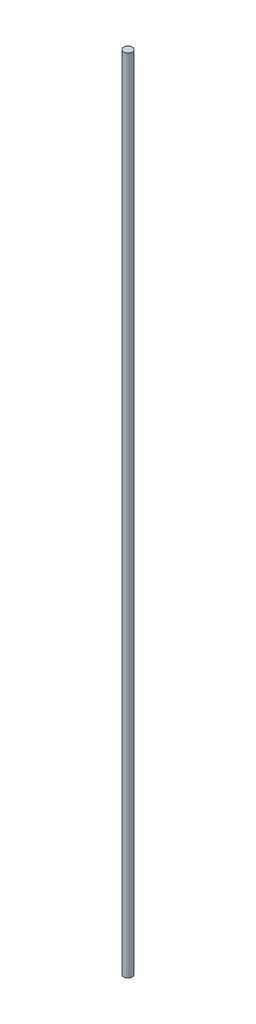
ISO-10303-21;
HEADER;
FILE_DESCRIPTION(('STEP AP214'),'2;1');
FILE_NAME('part.step','',(''),(''),'','','');
FILE_SCHEMA(('AUTOMOTIVE_DESIGN { 1 0 10303 214 1 1 1 1 }'));
ENDSEC;
DATA;
#1=APPLICATION_CONTEXT('core data for automotive mechanical design processes');
#2=APPLICATION_PROTOCOL_DEFINITION('international standard','automotive_design',2000,#1);
#3=PRODUCT_CONTEXT('',#1,'mechanical');
#4=PRODUCT('Part','Part','',(#3));
#5=PRODUCT_RELATED_PRODUCT_CATEGORY('part','',(#4));
#6=PRODUCT_DEFINITION_FORMATION('','',#4);
#7=PRODUCT_DEFINITION_CONTEXT('part definition',#1,'design');
#8=PRODUCT_DEFINITION('design','',#6,#7);
#9=PRODUCT_DEFINITION_SHAPE('','',#8);
#10=(LENGTH_UNIT() NAMED_UNIT(*) SI_UNIT(.MILLI.,.METRE.));
#11=(NAMED_UNIT(*) PLANE_ANGLE_UNIT() SI_UNIT($,.RADIAN.));
#12=(NAMED_UNIT(*) SI_UNIT($,.STERADIAN.) SOLID_ANGLE_UNIT());
#13=UNCERTAINTY_MEASURE_WITH_UNIT(LENGTH_MEASURE(1.E-05),#10,'distance_accuracy_value','');
#14=(GEOMETRIC_REPRESENTATION_CONTEXT(3) GLOBAL_UNCERTAINTY_ASSIGNED_CONTEXT((#13)) GLOBAL_UNIT_ASSIGNED_CONTEXT((#10,
#11,#12)) REPRESENTATION_CONTEXT('',''));
#15=CARTESIAN_POINT('',(0.,0.,0.));
#16=DIRECTION('',(0.,0.,1.));
#17=DIRECTION('',(1.,0.,0.));
#18=AXIS2_PLACEMENT_3D('',#15,#16,#17);
#19=CARTESIAN_POINT('',(0.,147.,0.));
#20=DIRECTION('',(0.,-1.,0.));
#21=DIRECTION('',(0.,0.,-1.));
#22=AXIS2_PLACEMENT_3D('',#19,#20,#21);
#23=PLANE('',#22);
#24=CARTESIAN_POINT('',(0.,147.,0.));
#25=DIRECTION('',(0.,-1.,0.));
#26=DIRECTION('',(1.,0.,0.));
#27=AXIS2_PLACEMENT_3D('',#24,#25,#26);
#28=CIRCLE('',#27,0.8);
#29=CARTESIAN_POINT('',(0.8,147.,0.));
#30=VERTEX_POINT('',#29);
#31=EDGE_CURVE('E11',#30,#30,#28,.T.);
#32=ORIENTED_EDGE('',*,*,#31,.F.);
#33=EDGE_LOOP('',(#32));
#34=FACE_BOUND('',#33,.T.);
#35=ADVANCED_FACE('F17',(#34),#23,.F.);
#36=CARTESIAN_POINT('',(0.,154.35,0.));
#37=DIRECTION('',(0.,-1.,0.));
#38=DIRECTION('',(-1.,0.,0.));
#39=AXIS2_PLACEMENT_3D('',#36,#37,#38);
#40=CYLINDRICAL_SURFACE('',#39,0.8);
#41=CARTESIAN_POINT('',(0.,0.,0.));
#42=DIRECTION('',(0.,1.,0.));
#43=DIRECTION('',(1.,0.,0.));
#44=AXIS2_PLACEMENT_3D('',#41,#42,#43);
#45=CIRCLE('',#44,0.8);
#46=CARTESIAN_POINT('',(0.8,0.,0.));
#47=VERTEX_POINT('',#46);
#48=EDGE_CURVE('E41',#47,#47,#45,.T.);
#49=ORIENTED_EDGE('',*,*,#48,.T.);
#50=DIRECTION('',(0.,1.,0.));
#51=VECTOR('',#50,1.);
#52=CARTESIAN_POINT('',(0.8,154.35,0.));
#53=LINE('',#52,#51);
#54=EDGE_CURVE('E26',#47,#30,#53,.T.);
#55=ORIENTED_EDGE('',*,*,#54,.T.);
#56=ORIENTED_EDGE('',*,*,#31,.T.);
#57=ORIENTED_EDGE('',*,*,#54,.F.);
#58=EDGE_LOOP('',(#49,#55,#56,#57));
#59=FACE_BOUND('',#58,.T.);
#60=ADVANCED_FACE('F19',(#59),#40,.T.);
#61=CARTESIAN_POINT('',(0.,0.,0.));
#62=DIRECTION('',(0.,-1.,0.));
#63=DIRECTION('',(0.,0.,-1.));
#64=AXIS2_PLACEMENT_3D('',#61,#62,#63);
#65=PLANE('',#64);
#66=ORIENTED_EDGE('',*,*,#48,.F.);
#67=EDGE_LOOP('',(#66));
#68=FACE_BOUND('',#67,.T.);
#69=ADVANCED_FACE('F60',(#68),#65,.T.);
#70=CLOSED_SHELL('',(#35,#60,#69));
#71=MANIFOLD_SOLID_BREP('B1',#70);
#72=ADVANCED_BREP_SHAPE_REPRESENTATION('',(#18,#71),#14);
#73=SHAPE_DEFINITION_REPRESENTATION(#9,#72);
ENDSEC;
END-ISO-10303-21;
